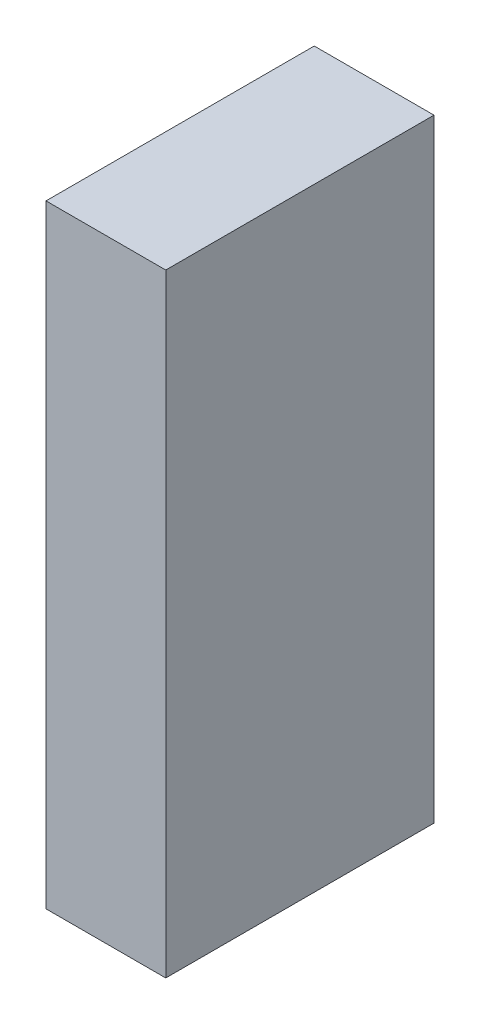
ISO-10303-21;
HEADER;
FILE_DESCRIPTION(('STEP AP214'),'2;1');
FILE_NAME('part.step','',(''),(''),'','','');
FILE_SCHEMA(('AUTOMOTIVE_DESIGN { 1 0 10303 214 1 1 1 1 }'));
ENDSEC;
DATA;
#1=APPLICATION_CONTEXT('core data for automotive mechanical design processes');
#2=APPLICATION_PROTOCOL_DEFINITION('international standard','automotive_design',2000,#1);
#3=PRODUCT_CONTEXT('',#1,'mechanical');
#4=PRODUCT('Part','Part','',(#3));
#5=PRODUCT_RELATED_PRODUCT_CATEGORY('part','',(#4));
#6=PRODUCT_DEFINITION_FORMATION('','',#4);
#7=PRODUCT_DEFINITION_CONTEXT('part definition',#1,'design');
#8=PRODUCT_DEFINITION('design','',#6,#7);
#9=PRODUCT_DEFINITION_SHAPE('','',#8);
#10=(LENGTH_UNIT() NAMED_UNIT(*) SI_UNIT(.MILLI.,.METRE.));
#11=(NAMED_UNIT(*) PLANE_ANGLE_UNIT() SI_UNIT($,.RADIAN.));
#12=(NAMED_UNIT(*) SI_UNIT($,.STERADIAN.) SOLID_ANGLE_UNIT());
#13=UNCERTAINTY_MEASURE_WITH_UNIT(LENGTH_MEASURE(1.E-05),#10,'distance_accuracy_value','');
#14=(GEOMETRIC_REPRESENTATION_CONTEXT(3) GLOBAL_UNCERTAINTY_ASSIGNED_CONTEXT((#13)) GLOBAL_UNIT_ASSIGNED_CONTEXT((#10,
#11,#12)) REPRESENTATION_CONTEXT('',''));
#15=CARTESIAN_POINT('',(0.,0.,0.));
#16=DIRECTION('',(0.,0.,1.));
#17=DIRECTION('',(1.,0.,0.));
#18=AXIS2_PLACEMENT_3D('',#15,#16,#17);
#19=CARTESIAN_POINT('',(-12.5,128.,28.));
#20=DIRECTION('',(1.,0.,0.));
#21=DIRECTION('',(0.,0.,-1.));
#22=AXIS2_PLACEMENT_3D('',#19,#20,#21);
#23=PLANE('',#22);
#24=DIRECTION('',(0.,0.,1.));
#25=VECTOR('',#24,1.);
#26=CARTESIAN_POINT('',(-12.5,0.,28.));
#27=LINE('',#26,#25);
#28=CARTESIAN_POINT('',(-12.5,0.,-28.));
#29=VERTEX_POINT('',#28);
#30=CARTESIAN_POINT('',(-12.5,0.,28.));
#31=VERTEX_POINT('',#30);
#32=EDGE_CURVE('E111',#29,#31,#27,.T.);
#33=ORIENTED_EDGE('',*,*,#32,.T.);
#34=DIRECTION('',(0.,-1.,0.));
#35=VECTOR('',#34,1.);
#36=CARTESIAN_POINT('',(-12.5,128.,28.));
#37=LINE('',#36,#35);
#38=CARTESIAN_POINT('',(-12.5,128.,28.));
#39=VERTEX_POINT('',#38);
#40=EDGE_CURVE('E11',#39,#31,#37,.T.);
#41=ORIENTED_EDGE('',*,*,#40,.F.);
#42=DIRECTION('',(0.,0.,1.));
#43=VECTOR('',#42,1.);
#44=CARTESIAN_POINT('',(-12.5,128.,28.));
#45=LINE('',#44,#43);
#46=CARTESIAN_POINT('',(-12.5,128.,-28.));
#47=VERTEX_POINT('',#46);
#48=EDGE_CURVE('E95',#47,#39,#45,.T.);
#49=ORIENTED_EDGE('',*,*,#48,.F.);
#50=DIRECTION('',(0.,-1.,0.));
#51=VECTOR('',#50,1.);
#52=CARTESIAN_POINT('',(-12.5,128.,-28.));
#53=LINE('',#52,#51);
#54=EDGE_CURVE('E107',#47,#29,#53,.T.);
#55=ORIENTED_EDGE('',*,*,#54,.T.);
#56=EDGE_LOOP('',(#33,#41,#49,#55));
#57=FACE_BOUND('',#56,.T.);
#58=ADVANCED_FACE('F43',(#57),#23,.F.);
#59=CARTESIAN_POINT('',(12.5,128.,28.));
#60=DIRECTION('',(0.,0.,-1.));
#61=DIRECTION('',(-1.,0.,0.));
#62=AXIS2_PLACEMENT_3D('',#59,#60,#61);
#63=PLANE('',#62);
#64=DIRECTION('',(1.,0.,0.));
#65=VECTOR('',#64,1.);
#66=CARTESIAN_POINT('',(12.5,0.,28.));
#67=LINE('',#66,#65);
#68=CARTESIAN_POINT('',(12.5,0.,28.));
#69=VERTEX_POINT('',#68);
#70=EDGE_CURVE('E100',#31,#69,#67,.T.);
#71=ORIENTED_EDGE('',*,*,#70,.T.);
#72=DIRECTION('',(0.,-1.,0.));
#73=VECTOR('',#72,1.);
#74=CARTESIAN_POINT('',(12.5,128.,28.));
#75=LINE('',#74,#73);
#76=CARTESIAN_POINT('',(12.5,128.,28.));
#77=VERTEX_POINT('',#76);
#78=EDGE_CURVE('E52',#77,#69,#75,.T.);
#79=ORIENTED_EDGE('',*,*,#78,.F.);
#80=DIRECTION('',(1.,0.,0.));
#81=VECTOR('',#80,1.);
#82=CARTESIAN_POINT('',(12.5,128.,28.));
#83=LINE('',#82,#81);
#84=EDGE_CURVE('E90',#39,#77,#83,.T.);
#85=ORIENTED_EDGE('',*,*,#84,.F.);
#86=ORIENTED_EDGE('',*,*,#40,.T.);
#87=EDGE_LOOP('',(#71,#79,#85,#86));
#88=FACE_BOUND('',#87,.T.);
#89=ADVANCED_FACE('F99',(#88),#63,.F.);
#90=CARTESIAN_POINT('',(12.5,128.,28.));
#91=DIRECTION('',(-1.,0.,0.));
#92=DIRECTION('',(0.,0.,1.));
#93=AXIS2_PLACEMENT_3D('',#90,#91,#92);
#94=PLANE('',#93);
#95=DIRECTION('',(0.,0.,-1.));
#96=VECTOR('',#95,1.);
#97=CARTESIAN_POINT('',(12.5,0.,28.));
#98=LINE('',#97,#96);
#99=CARTESIAN_POINT('',(12.5,0.,-28.));
#100=VERTEX_POINT('',#99);
#101=EDGE_CURVE('E77',#69,#100,#98,.T.);
#102=ORIENTED_EDGE('',*,*,#101,.T.);
#103=DIRECTION('',(0.,-1.,0.));
#104=VECTOR('',#103,1.);
#105=CARTESIAN_POINT('',(12.5,128.,-28.));
#106=LINE('',#105,#104);
#107=CARTESIAN_POINT('',(12.5,128.,-28.));
#108=VERTEX_POINT('',#107);
#109=EDGE_CURVE('E102',#108,#100,#106,.T.);
#110=ORIENTED_EDGE('',*,*,#109,.F.);
#111=DIRECTION('',(0.,0.,-1.));
#112=VECTOR('',#111,1.);
#113=CARTESIAN_POINT('',(12.5,128.,28.));
#114=LINE('',#113,#112);
#115=EDGE_CURVE('E93',#77,#108,#114,.T.);
#116=ORIENTED_EDGE('',*,*,#115,.F.);
#117=ORIENTED_EDGE('',*,*,#78,.T.);
#118=EDGE_LOOP('',(#102,#110,#116,#117));
#119=FACE_BOUND('',#118,.T.);
#120=ADVANCED_FACE('F103',(#119),#94,.F.);
#121=CARTESIAN_POINT('',(12.5,128.,-28.));
#122=DIRECTION('',(0.,0.,1.));
#123=DIRECTION('',(1.,0.,0.));
#124=AXIS2_PLACEMENT_3D('',#121,#122,#123);
#125=PLANE('',#124);
#126=DIRECTION('',(-1.,0.,0.));
#127=VECTOR('',#126,1.);
#128=CARTESIAN_POINT('',(12.5,0.,-28.));
#129=LINE('',#128,#127);
#130=EDGE_CURVE('E83',#100,#29,#129,.T.);
#131=ORIENTED_EDGE('',*,*,#130,.T.);
#132=ORIENTED_EDGE('',*,*,#54,.F.);
#133=DIRECTION('',(-1.,0.,0.));
#134=VECTOR('',#133,1.);
#135=CARTESIAN_POINT('',(12.5,128.,-28.));
#136=LINE('',#135,#134);
#137=EDGE_CURVE('E60',#108,#47,#136,.T.);
#138=ORIENTED_EDGE('',*,*,#137,.F.);
#139=ORIENTED_EDGE('',*,*,#109,.T.);
#140=EDGE_LOOP('',(#131,#132,#138,#139));
#141=FACE_BOUND('',#140,.T.);
#142=ADVANCED_FACE('F124',(#141),#125,.F.);
#143=CARTESIAN_POINT('',(0.,128.,0.));
#144=DIRECTION('',(0.,1.,0.));
#145=DIRECTION('',(0.,0.,1.));
#146=AXIS2_PLACEMENT_3D('',#143,#144,#145);
#147=PLANE('',#146);
#148=ORIENTED_EDGE('',*,*,#48,.T.);
#149=ORIENTED_EDGE('',*,*,#84,.T.);
#150=ORIENTED_EDGE('',*,*,#115,.T.);
#151=ORIENTED_EDGE('',*,*,#137,.T.);
#152=EDGE_LOOP('',(#148,#149,#150,#151));
#153=FACE_BOUND('',#152,.T.);
#154=ADVANCED_FACE('F91',(#153),#147,.T.);
#155=CARTESIAN_POINT('',(0.,0.,0.));
#156=DIRECTION('',(0.,1.,0.));
#157=DIRECTION('',(0.,0.,1.));
#158=AXIS2_PLACEMENT_3D('',#155,#156,#157);
#159=PLANE('',#158);
#160=ORIENTED_EDGE('',*,*,#32,.F.);
#161=ORIENTED_EDGE('',*,*,#130,.F.);
#162=ORIENTED_EDGE('',*,*,#101,.F.);
#163=ORIENTED_EDGE('',*,*,#70,.F.);
#164=EDGE_LOOP('',(#160,#161,#162,#163));
#165=FACE_BOUND('',#164,.T.);
#166=ADVANCED_FACE('F127',(#165),#159,.F.);
#167=CLOSED_SHELL('',(#58,#89,#120,#142,#154,#166));
#168=MANIFOLD_SOLID_BREP('B2',#167);
#169=ADVANCED_BREP_SHAPE_REPRESENTATION('',(#18,#168),#14);
#170=SHAPE_DEFINITION_REPRESENTATION(#9,#169);
ENDSEC;
END-ISO-10303-21;
